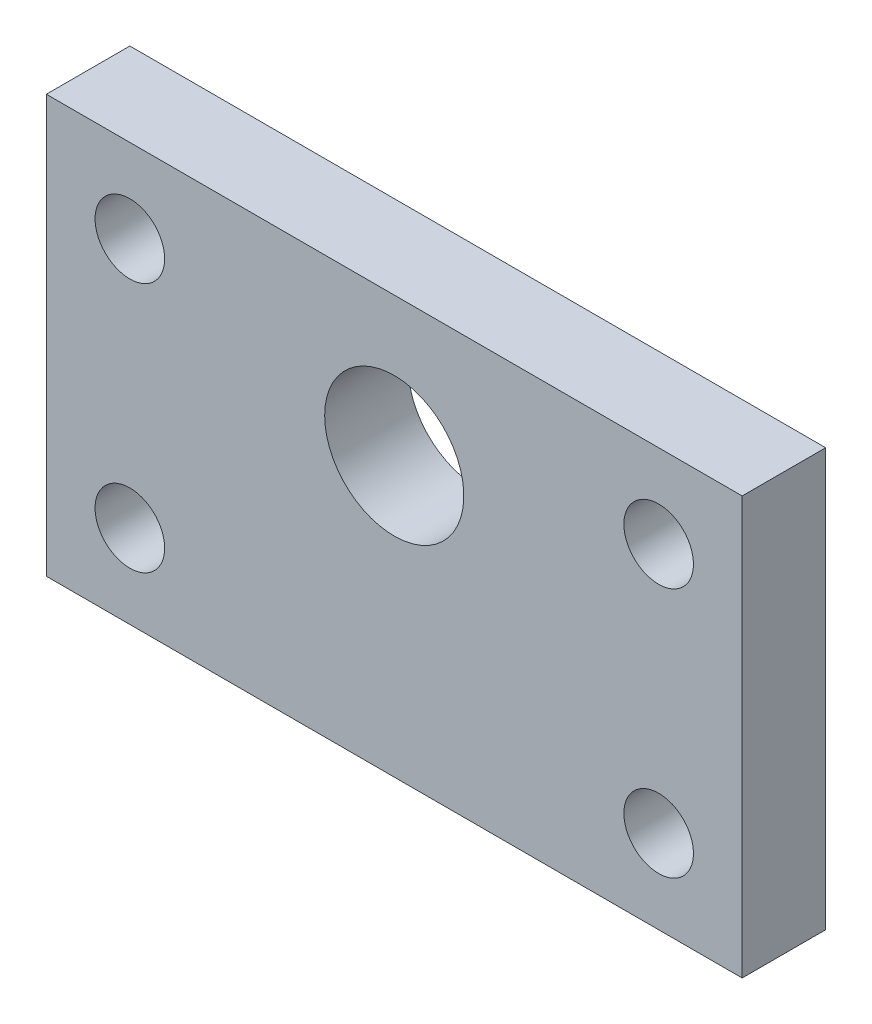
ISO-10303-21;
HEADER;
FILE_DESCRIPTION(('STEP AP214'),'2;1');
FILE_NAME('part.step','',(''),(''),'','','');
FILE_SCHEMA(('AUTOMOTIVE_DESIGN { 1 0 10303 214 1 1 1 1 }'));
ENDSEC;
DATA;
#1=APPLICATION_CONTEXT('core data for automotive mechanical design processes');
#2=APPLICATION_PROTOCOL_DEFINITION('international standard','automotive_design',2000,#1);
#3=PRODUCT_CONTEXT('',#1,'mechanical');
#4=PRODUCT('Part','Part','',(#3));
#5=PRODUCT_RELATED_PRODUCT_CATEGORY('part','',(#4));
#6=PRODUCT_DEFINITION_FORMATION('','',#4);
#7=PRODUCT_DEFINITION_CONTEXT('part definition',#1,'design');
#8=PRODUCT_DEFINITION('design','',#6,#7);
#9=PRODUCT_DEFINITION_SHAPE('','',#8);
#10=(LENGTH_UNIT() NAMED_UNIT(*) SI_UNIT(.MILLI.,.METRE.));
#11=(NAMED_UNIT(*) PLANE_ANGLE_UNIT() SI_UNIT($,.RADIAN.));
#12=(NAMED_UNIT(*) SI_UNIT($,.STERADIAN.) SOLID_ANGLE_UNIT());
#13=UNCERTAINTY_MEASURE_WITH_UNIT(LENGTH_MEASURE(1.E-05),#10,'distance_accuracy_value','');
#14=(GEOMETRIC_REPRESENTATION_CONTEXT(3) GLOBAL_UNCERTAINTY_ASSIGNED_CONTEXT((#13)) GLOBAL_UNIT_ASSIGNED_CONTEXT((#10,
#11,#12)) REPRESENTATION_CONTEXT('',''));
#15=CARTESIAN_POINT('',(0.,0.,0.));
#16=DIRECTION('',(0.,0.,1.));
#17=DIRECTION('',(1.,0.,0.));
#18=AXIS2_PLACEMENT_3D('',#15,#16,#17);
#19=CARTESIAN_POINT('',(0.,0.,30.));
#20=DIRECTION('',(0.,0.,1.));
#21=DIRECTION('',(1.,0.,0.));
#22=AXIS2_PLACEMENT_3D('',#19,#20,#21);
#23=PLANE('',#22);
#24=CARTESIAN_POINT('',(95.,45.,30.));
#25=DIRECTION('',(0.,0.,1.));
#26=DIRECTION('',(-1.,0.,0.));
#27=AXIS2_PLACEMENT_3D('',#24,#25,#26);
#28=CIRCLE('',#27,12.5);
#29=CARTESIAN_POINT('',(82.5,45.,30.));
#30=VERTEX_POINT('',#29);
#31=EDGE_CURVE('E131',#30,#30,#28,.T.);
#32=ORIENTED_EDGE('',*,*,#31,.F.);
#33=EDGE_LOOP('',(#32));
#34=FACE_BOUND('',#33,.T.);
#35=CARTESIAN_POINT('',(-95.,-45.,30.));
#36=DIRECTION('',(0.,0.,1.));
#37=DIRECTION('',(1.,0.,0.));
#38=AXIS2_PLACEMENT_3D('',#35,#36,#37);
#39=CIRCLE('',#38,12.5);
#40=CARTESIAN_POINT('',(-82.5,-45.,30.));
#41=VERTEX_POINT('',#40);
#42=EDGE_CURVE('E119',#41,#41,#39,.T.);
#43=ORIENTED_EDGE('',*,*,#42,.F.);
#44=EDGE_LOOP('',(#43));
#45=FACE_BOUND('',#44,.T.);
#46=DIRECTION('',(0.,1.,0.));
#47=VECTOR('',#46,1.);
#48=CARTESIAN_POINT('',(125.,75.,30.));
#49=LINE('',#48,#47);
#50=CARTESIAN_POINT('',(125.,-75.,30.));
#51=VERTEX_POINT('',#50);
#52=CARTESIAN_POINT('',(125.,75.,30.));
#53=VERTEX_POINT('',#52);
#54=EDGE_CURVE('E89',#51,#53,#49,.T.);
#55=ORIENTED_EDGE('',*,*,#54,.T.);
#56=DIRECTION('',(-1.,0.,0.));
#57=VECTOR('',#56,1.);
#58=CARTESIAN_POINT('',(-125.,75.,30.));
#59=LINE('',#58,#57);
#60=CARTESIAN_POINT('',(-125.,75.,30.));
#61=VERTEX_POINT('',#60);
#62=EDGE_CURVE('E84',#53,#61,#59,.T.);
#63=ORIENTED_EDGE('',*,*,#62,.T.);
#64=DIRECTION('',(0.,-1.,0.));
#65=VECTOR('',#64,1.);
#66=CARTESIAN_POINT('',(-125.,75.,30.));
#67=LINE('',#66,#65);
#68=CARTESIAN_POINT('',(-125.,-75.,30.));
#69=VERTEX_POINT('',#68);
#70=EDGE_CURVE('E87',#61,#69,#67,.T.);
#71=ORIENTED_EDGE('',*,*,#70,.T.);
#72=DIRECTION('',(1.,0.,0.));
#73=VECTOR('',#72,1.);
#74=CARTESIAN_POINT('',(-125.,-75.,30.));
#75=LINE('',#74,#73);
#76=EDGE_CURVE('E54',#69,#51,#75,.T.);
#77=ORIENTED_EDGE('',*,*,#76,.T.);
#78=EDGE_LOOP('',(#55,#63,#71,#77));
#79=FACE_BOUND('',#78,.T.);
#80=CARTESIAN_POINT('',(-95.,45.,30.));
#81=DIRECTION('',(0.,0.,1.));
#82=DIRECTION('',(1.,0.,0.));
#83=AXIS2_PLACEMENT_3D('',#80,#81,#82);
#84=CIRCLE('',#83,12.5);
#85=CARTESIAN_POINT('',(-82.5,45.,30.));
#86=VERTEX_POINT('',#85);
#87=EDGE_CURVE('E104',#86,#86,#84,.T.);
#88=ORIENTED_EDGE('',*,*,#87,.F.);
#89=EDGE_LOOP('',(#88));
#90=FACE_BOUND('',#89,.T.);
#91=CARTESIAN_POINT('',(95.,-45.,30.));
#92=DIRECTION('',(0.,0.,1.));
#93=DIRECTION('',(-1.,0.,0.));
#94=AXIS2_PLACEMENT_3D('',#91,#92,#93);
#95=CIRCLE('',#94,12.5);
#96=CARTESIAN_POINT('',(82.5,-45.,30.));
#97=VERTEX_POINT('',#96);
#98=EDGE_CURVE('E125',#97,#97,#95,.T.);
#99=ORIENTED_EDGE('',*,*,#98,.F.);
#100=EDGE_LOOP('',(#99));
#101=FACE_BOUND('',#100,.T.);
#102=CARTESIAN_POINT('',(0.,25.,30.));
#103=DIRECTION('',(0.,0.,1.));
#104=DIRECTION('',(-1.,0.,0.));
#105=AXIS2_PLACEMENT_3D('',#102,#103,#104);
#106=CIRCLE('',#105,25.);
#107=CARTESIAN_POINT('',(-25.,25.,30.));
#108=VERTEX_POINT('',#107);
#109=EDGE_CURVE('E137',#108,#108,#106,.T.);
#110=ORIENTED_EDGE('',*,*,#109,.F.);
#111=EDGE_LOOP('',(#110));
#112=FACE_BOUND('',#111,.T.);
#113=ADVANCED_FACE('F37',(#34,#45,#79,#90,#101,#112),#23,.T.);
#114=CARTESIAN_POINT('',(0.,0.,0.));
#115=DIRECTION('',(0.,0.,1.));
#116=DIRECTION('',(1.,0.,0.));
#117=AXIS2_PLACEMENT_3D('',#114,#115,#116);
#118=PLANE('',#117);
#119=DIRECTION('',(0.,1.,0.));
#120=VECTOR('',#119,1.);
#121=CARTESIAN_POINT('',(125.,75.,0.));
#122=LINE('',#121,#120);
#123=CARTESIAN_POINT('',(125.,-75.,0.));
#124=VERTEX_POINT('',#123);
#125=CARTESIAN_POINT('',(125.,75.,0.));
#126=VERTEX_POINT('',#125);
#127=EDGE_CURVE('E101',#124,#126,#122,.T.);
#128=ORIENTED_EDGE('',*,*,#127,.F.);
#129=DIRECTION('',(1.,0.,0.));
#130=VECTOR('',#129,1.);
#131=CARTESIAN_POINT('',(-125.,-75.,0.));
#132=LINE('',#131,#130);
#133=CARTESIAN_POINT('',(-125.,-75.,0.));
#134=VERTEX_POINT('',#133);
#135=EDGE_CURVE('E77',#134,#124,#132,.T.);
#136=ORIENTED_EDGE('',*,*,#135,.F.);
#137=DIRECTION('',(0.,-1.,0.));
#138=VECTOR('',#137,1.);
#139=CARTESIAN_POINT('',(-125.,75.,0.));
#140=LINE('',#139,#138);
#141=CARTESIAN_POINT('',(-125.,75.,0.));
#142=VERTEX_POINT('',#141);
#143=EDGE_CURVE('E71',#142,#134,#140,.T.);
#144=ORIENTED_EDGE('',*,*,#143,.F.);
#145=DIRECTION('',(-1.,0.,0.));
#146=VECTOR('',#145,1.);
#147=CARTESIAN_POINT('',(-125.,75.,0.));
#148=LINE('',#147,#146);
#149=EDGE_CURVE('E93',#126,#142,#148,.T.);
#150=ORIENTED_EDGE('',*,*,#149,.F.);
#151=EDGE_LOOP('',(#128,#136,#144,#150));
#152=FACE_BOUND('',#151,.T.);
#153=CARTESIAN_POINT('',(-95.,45.,0.));
#154=DIRECTION('',(0.,0.,1.));
#155=DIRECTION('',(1.,0.,0.));
#156=AXIS2_PLACEMENT_3D('',#153,#154,#155);
#157=CIRCLE('',#156,12.5);
#158=CARTESIAN_POINT('',(-82.5,45.,0.));
#159=VERTEX_POINT('',#158);
#160=EDGE_CURVE('E116',#159,#159,#157,.T.);
#161=ORIENTED_EDGE('',*,*,#160,.T.);
#162=EDGE_LOOP('',(#161));
#163=FACE_BOUND('',#162,.T.);
#164=CARTESIAN_POINT('',(-95.,-45.,0.));
#165=DIRECTION('',(0.,0.,1.));
#166=DIRECTION('',(1.,0.,0.));
#167=AXIS2_PLACEMENT_3D('',#164,#165,#166);
#168=CIRCLE('',#167,12.5);
#169=CARTESIAN_POINT('',(-82.5,-45.,0.));
#170=VERTEX_POINT('',#169);
#171=EDGE_CURVE('E122',#170,#170,#168,.T.);
#172=ORIENTED_EDGE('',*,*,#171,.T.);
#173=EDGE_LOOP('',(#172));
#174=FACE_BOUND('',#173,.T.);
#175=CARTESIAN_POINT('',(95.,-45.,0.));
#176=DIRECTION('',(0.,0.,1.));
#177=DIRECTION('',(-1.,0.,0.));
#178=AXIS2_PLACEMENT_3D('',#175,#176,#177);
#179=CIRCLE('',#178,12.5);
#180=CARTESIAN_POINT('',(82.5,-45.,0.));
#181=VERTEX_POINT('',#180);
#182=EDGE_CURVE('E128',#181,#181,#179,.T.);
#183=ORIENTED_EDGE('',*,*,#182,.T.);
#184=EDGE_LOOP('',(#183));
#185=FACE_BOUND('',#184,.T.);
#186=CARTESIAN_POINT('',(95.,45.,0.));
#187=DIRECTION('',(0.,0.,1.));
#188=DIRECTION('',(-1.,0.,0.));
#189=AXIS2_PLACEMENT_3D('',#186,#187,#188);
#190=CIRCLE('',#189,12.5);
#191=CARTESIAN_POINT('',(82.5,45.,0.));
#192=VERTEX_POINT('',#191);
#193=EDGE_CURVE('E134',#192,#192,#190,.T.);
#194=ORIENTED_EDGE('',*,*,#193,.T.);
#195=EDGE_LOOP('',(#194));
#196=FACE_BOUND('',#195,.T.);
#197=CARTESIAN_POINT('',(0.,25.,0.));
#198=DIRECTION('',(0.,0.,1.));
#199=DIRECTION('',(-1.,0.,0.));
#200=AXIS2_PLACEMENT_3D('',#197,#198,#199);
#201=CIRCLE('',#200,25.);
#202=CARTESIAN_POINT('',(-25.,25.,0.));
#203=VERTEX_POINT('',#202);
#204=EDGE_CURVE('E140',#203,#203,#201,.T.);
#205=ORIENTED_EDGE('',*,*,#204,.T.);
#206=EDGE_LOOP('',(#205));
#207=FACE_BOUND('',#206,.T.);
#208=ADVANCED_FACE('F112',(#152,#163,#174,#185,#196,#207),#118,.F.);
#209=CARTESIAN_POINT('',(125.,75.,30.));
#210=DIRECTION('',(-1.,0.,0.));
#211=DIRECTION('',(0.,0.,1.));
#212=AXIS2_PLACEMENT_3D('',#209,#210,#211);
#213=PLANE('',#212);
#214=ORIENTED_EDGE('',*,*,#127,.T.);
#215=DIRECTION('',(0.,0.,-1.));
#216=VECTOR('',#215,1.);
#217=CARTESIAN_POINT('',(125.,75.,30.));
#218=LINE('',#217,#216);
#219=EDGE_CURVE('E11',#53,#126,#218,.T.);
#220=ORIENTED_EDGE('',*,*,#219,.F.);
#221=ORIENTED_EDGE('',*,*,#54,.F.);
#222=DIRECTION('',(0.,0.,-1.));
#223=VECTOR('',#222,1.);
#224=CARTESIAN_POINT('',(125.,-75.,30.));
#225=LINE('',#224,#223);
#226=EDGE_CURVE('E97',#51,#124,#225,.T.);
#227=ORIENTED_EDGE('',*,*,#226,.T.);
#228=EDGE_LOOP('',(#214,#220,#221,#227));
#229=FACE_BOUND('',#228,.T.);
#230=ADVANCED_FACE('F39',(#229),#213,.F.);
#231=CARTESIAN_POINT('',(-125.,75.,30.));
#232=DIRECTION('',(0.,-1.,0.));
#233=DIRECTION('',(0.,0.,-1.));
#234=AXIS2_PLACEMENT_3D('',#231,#232,#233);
#235=PLANE('',#234);
#236=ORIENTED_EDGE('',*,*,#149,.T.);
#237=DIRECTION('',(0.,0.,-1.));
#238=VECTOR('',#237,1.);
#239=CARTESIAN_POINT('',(-125.,75.,30.));
#240=LINE('',#239,#238);
#241=EDGE_CURVE('E46',#61,#142,#240,.T.);
#242=ORIENTED_EDGE('',*,*,#241,.F.);
#243=ORIENTED_EDGE('',*,*,#62,.F.);
#244=ORIENTED_EDGE('',*,*,#219,.T.);
#245=EDGE_LOOP('',(#236,#242,#243,#244));
#246=FACE_BOUND('',#245,.T.);
#247=ADVANCED_FACE('F92',(#246),#235,.F.);
#248=CARTESIAN_POINT('',(-125.,75.,30.));
#249=DIRECTION('',(1.,0.,0.));
#250=DIRECTION('',(0.,0.,-1.));
#251=AXIS2_PLACEMENT_3D('',#248,#249,#250);
#252=PLANE('',#251);
#253=ORIENTED_EDGE('',*,*,#143,.T.);
#254=DIRECTION('',(0.,0.,-1.));
#255=VECTOR('',#254,1.);
#256=CARTESIAN_POINT('',(-125.,-75.,30.));
#257=LINE('',#256,#255);
#258=EDGE_CURVE('E94',#69,#134,#257,.T.);
#259=ORIENTED_EDGE('',*,*,#258,.F.);
#260=ORIENTED_EDGE('',*,*,#70,.F.);
#261=ORIENTED_EDGE('',*,*,#241,.T.);
#262=EDGE_LOOP('',(#253,#259,#260,#261));
#263=FACE_BOUND('',#262,.T.);
#264=ADVANCED_FACE('F95',(#263),#252,.F.);
#265=CARTESIAN_POINT('',(-125.,-75.,30.));
#266=DIRECTION('',(0.,1.,0.));
#267=DIRECTION('',(0.,0.,1.));
#268=AXIS2_PLACEMENT_3D('',#265,#266,#267);
#269=PLANE('',#268);
#270=ORIENTED_EDGE('',*,*,#135,.T.);
#271=ORIENTED_EDGE('',*,*,#226,.F.);
#272=ORIENTED_EDGE('',*,*,#76,.F.);
#273=ORIENTED_EDGE('',*,*,#258,.T.);
#274=EDGE_LOOP('',(#270,#271,#272,#273));
#275=FACE_BOUND('',#274,.T.);
#276=ADVANCED_FACE('F109',(#275),#269,.F.);
#277=CARTESIAN_POINT('',(-95.,45.,30.));
#278=DIRECTION('',(0.,0.,-1.));
#279=DIRECTION('',(-1.,0.,0.));
#280=AXIS2_PLACEMENT_3D('',#277,#278,#279);
#281=CYLINDRICAL_SURFACE('',#280,12.5);
#282=ORIENTED_EDGE('',*,*,#87,.T.);
#283=EDGE_LOOP('',(#282));
#284=FACE_BOUND('',#283,.T.);
#285=ORIENTED_EDGE('',*,*,#160,.F.);
#286=EDGE_LOOP('',(#285));
#287=FACE_BOUND('',#286,.T.);
#288=ADVANCED_FACE('F159',(#284,#287),#281,.F.);
#289=CARTESIAN_POINT('',(-95.,-45.,30.));
#290=DIRECTION('',(0.,0.,-1.));
#291=DIRECTION('',(-1.,0.,0.));
#292=AXIS2_PLACEMENT_3D('',#289,#290,#291);
#293=CYLINDRICAL_SURFACE('',#292,12.5);
#294=ORIENTED_EDGE('',*,*,#42,.T.);
#295=EDGE_LOOP('',(#294));
#296=FACE_BOUND('',#295,.T.);
#297=ORIENTED_EDGE('',*,*,#171,.F.);
#298=EDGE_LOOP('',(#297));
#299=FACE_BOUND('',#298,.T.);
#300=ADVANCED_FACE('F213',(#296,#299),#293,.F.);
#301=CARTESIAN_POINT('',(95.,-45.,30.));
#302=DIRECTION('',(0.,0.,-1.));
#303=DIRECTION('',(-1.,0.,0.));
#304=AXIS2_PLACEMENT_3D('',#301,#302,#303);
#305=CYLINDRICAL_SURFACE('',#304,12.5);
#306=ORIENTED_EDGE('',*,*,#98,.T.);
#307=EDGE_LOOP('',(#306));
#308=FACE_BOUND('',#307,.T.);
#309=ORIENTED_EDGE('',*,*,#182,.F.);
#310=EDGE_LOOP('',(#309));
#311=FACE_BOUND('',#310,.T.);
#312=ADVANCED_FACE('F222',(#308,#311),#305,.F.);
#313=CARTESIAN_POINT('',(95.,45.,30.));
#314=DIRECTION('',(0.,0.,-1.));
#315=DIRECTION('',(-1.,0.,0.));
#316=AXIS2_PLACEMENT_3D('',#313,#314,#315);
#317=CYLINDRICAL_SURFACE('',#316,12.5);
#318=ORIENTED_EDGE('',*,*,#31,.T.);
#319=EDGE_LOOP('',(#318));
#320=FACE_BOUND('',#319,.T.);
#321=ORIENTED_EDGE('',*,*,#193,.F.);
#322=EDGE_LOOP('',(#321));
#323=FACE_BOUND('',#322,.T.);
#324=ADVANCED_FACE('F231',(#320,#323),#317,.F.);
#325=CARTESIAN_POINT('',(0.,25.,30.));
#326=DIRECTION('',(0.,0.,-1.));
#327=DIRECTION('',(-1.,0.,0.));
#328=AXIS2_PLACEMENT_3D('',#325,#326,#327);
#329=CYLINDRICAL_SURFACE('',#328,25.);
#330=ORIENTED_EDGE('',*,*,#109,.T.);
#331=EDGE_LOOP('',(#330));
#332=FACE_BOUND('',#331,.T.);
#333=ORIENTED_EDGE('',*,*,#204,.F.);
#334=EDGE_LOOP('',(#333));
#335=FACE_BOUND('',#334,.T.);
#336=ADVANCED_FACE('F146',(#332,#335),#329,.F.);
#337=CLOSED_SHELL('',(#113,#208,#230,#247,#264,#276,#288,#300,#312,#324,#336));
#338=MANIFOLD_SOLID_BREP('B2',#337);
#339=ADVANCED_BREP_SHAPE_REPRESENTATION('',(#18,#338),#14);
#340=SHAPE_DEFINITION_REPRESENTATION(#9,#339);
ENDSEC;
END-ISO-10303-21;
